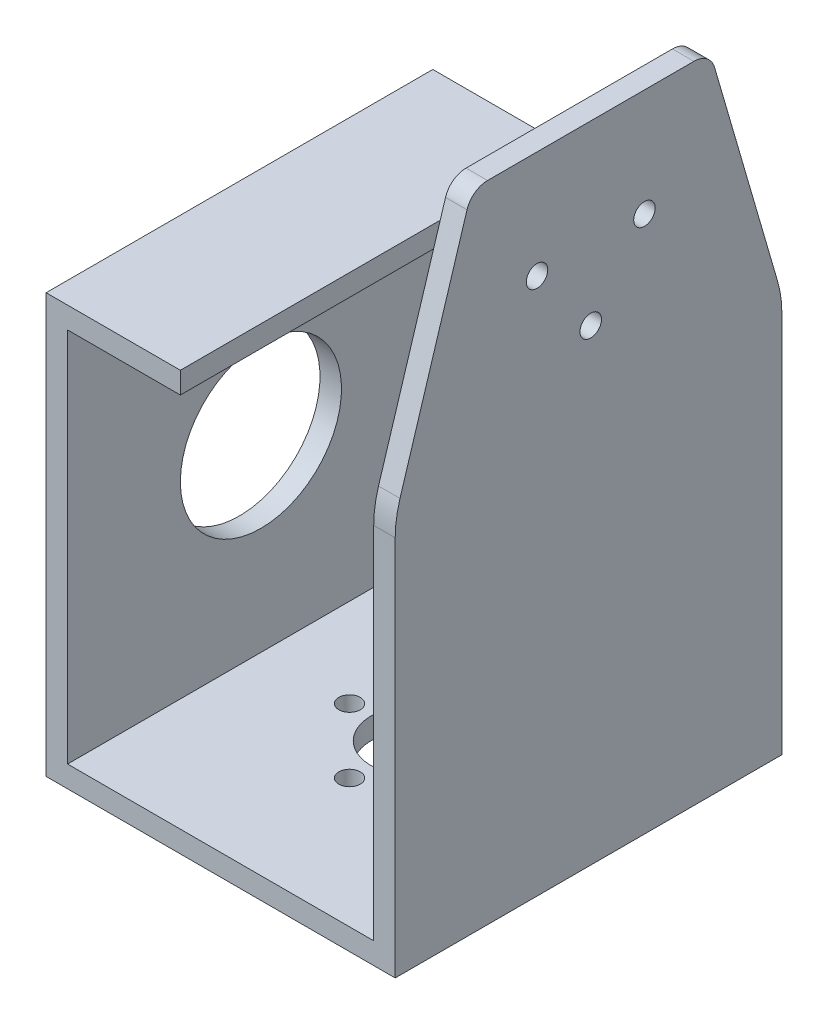
ISO-10303-21;
HEADER;
FILE_DESCRIPTION(('STEP AP214'),'2;1');
FILE_NAME('part.step','',(''),(''),'','','');
FILE_SCHEMA(('AUTOMOTIVE_DESIGN { 1 0 10303 214 1 1 1 1 }'));
ENDSEC;
DATA;
#1=APPLICATION_CONTEXT('core data for automotive mechanical design processes');
#2=APPLICATION_PROTOCOL_DEFINITION('international standard','automotive_design',2000,#1);
#3=PRODUCT_CONTEXT('',#1,'mechanical');
#4=PRODUCT('Part','Part','',(#3));
#5=PRODUCT_RELATED_PRODUCT_CATEGORY('part','',(#4));
#6=PRODUCT_DEFINITION_FORMATION('','',#4);
#7=PRODUCT_DEFINITION_CONTEXT('part definition',#1,'design');
#8=PRODUCT_DEFINITION('design','',#6,#7);
#9=PRODUCT_DEFINITION_SHAPE('','',#8);
#10=(LENGTH_UNIT() NAMED_UNIT(*) SI_UNIT(.MILLI.,.METRE.));
#11=(NAMED_UNIT(*) PLANE_ANGLE_UNIT() SI_UNIT($,.RADIAN.));
#12=(NAMED_UNIT(*) SI_UNIT($,.STERADIAN.) SOLID_ANGLE_UNIT());
#13=UNCERTAINTY_MEASURE_WITH_UNIT(LENGTH_MEASURE(1.E-05),#10,'distance_accuracy_value','');
#14=(GEOMETRIC_REPRESENTATION_CONTEXT(3) GLOBAL_UNCERTAINTY_ASSIGNED_CONTEXT((#13)) GLOBAL_UNIT_ASSIGNED_CONTEXT((#10,
#11,#12)) REPRESENTATION_CONTEXT('',''));
#15=CARTESIAN_POINT('',(0.,0.,0.));
#16=DIRECTION('',(0.,0.,1.));
#17=DIRECTION('',(1.,0.,0.));
#18=AXIS2_PLACEMENT_3D('',#15,#16,#17);
#19=CARTESIAN_POINT('',(20.,-37.,36.));
#20=DIRECTION('',(-1.,0.,0.));
#21=DIRECTION('',(0.,0.,1.));
#22=AXIS2_PLACEMENT_3D('',#19,#20,#21);
#23=PLANE('',#22);
#24=CARTESIAN_POINT('',(20.,13.,22.7976167047793));
#25=DIRECTION('',(1.,0.,0.));
#26=DIRECTION('',(0.,0.,-1.));
#27=AXIS2_PLACEMENT_3D('',#24,#25,#26);
#28=CIRCLE('',#27,1.);
#29=CARTESIAN_POINT('',(20.,13.,21.7976167047793));
#30=VERTEX_POINT('',#29);
#31=EDGE_CURVE('E194',#30,#30,#28,.T.);
#32=ORIENTED_EDGE('',*,*,#31,.F.);
#33=EDGE_LOOP('',(#32));
#34=FACE_BOUND('',#33,.T.);
#35=CARTESIAN_POINT('',(20.,13.,12.7976167047793));
#36=DIRECTION('',(1.,0.,0.));
#37=DIRECTION('',(0.,0.,-1.));
#38=AXIS2_PLACEMENT_3D('',#35,#36,#37);
#39=CIRCLE('',#38,1.);
#40=CARTESIAN_POINT('',(20.,13.,11.7976167047793));
#41=VERTEX_POINT('',#40);
#42=EDGE_CURVE('E186',#41,#41,#39,.T.);
#43=ORIENTED_EDGE('',*,*,#42,.F.);
#44=EDGE_LOOP('',(#43));
#45=FACE_BOUND('',#44,.T.);
#46=CARTESIAN_POINT('',(20.,6.5,17.7976167047793));
#47=DIRECTION('',(1.,0.,0.));
#48=DIRECTION('',(0.,0.,-1.));
#49=AXIS2_PLACEMENT_3D('',#46,#47,#48);
#50=CIRCLE('',#49,1.);
#51=CARTESIAN_POINT('',(20.,6.5,16.7976167047793));
#52=VERTEX_POINT('',#51);
#53=EDGE_CURVE('E197',#52,#52,#50,.T.);
#54=ORIENTED_EDGE('',*,*,#53,.F.);
#55=EDGE_LOOP('',(#54));
#56=FACE_BOUND('',#55,.T.);
#57=CARTESIAN_POINT('',(20.,-1.5128516171511,26.));
#58=DIRECTION('',(1.,0.,0.));
#59=DIRECTION('',(0.,0.,-1.));
#60=AXIS2_PLACEMENT_3D('',#57,#58,#59);
#61=CIRCLE('',#60,10.);
#62=CARTESIAN_POINT('',(20.,1.44515121428843,35.5524980632919));
#63=VERTEX_POINT('',#62);
#64=CARTESIAN_POINT('',(20.,-1.51285161715114,36.));
#65=VERTEX_POINT('',#64);
#66=EDGE_CURVE('E182',#63,#65,#61,.T.);
#67=ORIENTED_EDGE('',*,*,#66,.T.);
#68=DIRECTION('',(0.,1.,0.));
#69=VECTOR('',#68,1.);
#70=CARTESIAN_POINT('',(20.,-37.,36.));
#71=LINE('',#70,#69);
#72=CARTESIAN_POINT('',(20.,-37.,36.));
#73=VERTEX_POINT('',#72);
#74=EDGE_CURVE('E216',#73,#65,#71,.T.);
#75=ORIENTED_EDGE('',*,*,#74,.F.);
#76=DIRECTION('',(0.,0.,-1.));
#77=VECTOR('',#76,1.);
#78=CARTESIAN_POINT('',(20.,-37.,36.));
#79=LINE('',#78,#77);
#80=CARTESIAN_POINT('',(20.,-37.,0.));
#81=VERTEX_POINT('',#80);
#82=EDGE_CURVE('E263',#73,#81,#79,.T.);
#83=ORIENTED_EDGE('',*,*,#82,.T.);
#84=DIRECTION('',(0.,1.,0.));
#85=VECTOR('',#84,1.);
#86=CARTESIAN_POINT('',(20.,-37.,0.));
#87=LINE('',#86,#85);
#88=CARTESIAN_POINT('',(20.,-1.42495068080421,0.));
#89=VERTEX_POINT('',#88);
#90=EDGE_CURVE('E238',#81,#89,#87,.T.);
#91=ORIENTED_EDGE('',*,*,#90,.T.);
#92=CARTESIAN_POINT('',(20.,-1.42495068080419,10.));
#93=DIRECTION('',(1.,0.,0.));
#94=DIRECTION('',(0.,0.,-1.));
#95=AXIS2_PLACEMENT_3D('',#92,#93,#94);
#96=CIRCLE('',#95,10.);
#97=CARTESIAN_POINT('',(20.,1.36823547054476,0.398015250797762));
#98=VERTEX_POINT('',#97);
#99=EDGE_CURVE('E58',#89,#98,#96,.T.);
#100=ORIENTED_EDGE('',*,*,#99,.T.);
#101=DIRECTION('',(0.,0.960198474920225,0.279318615134893));
#102=VECTOR('',#101,1.);
#103=CARTESIAN_POINT('',(20.,1.36823547054476,0.398015250797761));
#104=LINE('',#103,#102);
#105=CARTESIAN_POINT('',(20.,21.5586372302698,6.27133749181885));
#106=VERTEX_POINT('',#105);
#107=EDGE_CURVE('E153',#98,#106,#104,.T.);
#108=ORIENTED_EDGE('',*,*,#107,.T.);
#109=CARTESIAN_POINT('',(20.,21.,8.1917344416593));
#110=DIRECTION('',(1.,0.,0.));
#111=DIRECTION('',(0.,0.,-1.));
#112=AXIS2_PLACEMENT_3D('',#109,#110,#111);
#113=CIRCLE('',#112,2.);
#114=CARTESIAN_POINT('',(20.,23.,8.19173444165931));
#115=VERTEX_POINT('',#114);
#116=EDGE_CURVE('E162',#106,#115,#113,.T.);
#117=ORIENTED_EDGE('',*,*,#116,.T.);
#118=DIRECTION('',(0.,0.,-1.));
#119=VECTOR('',#118,1.);
#120=CARTESIAN_POINT('',(20.,23.,36.));
#121=LINE('',#120,#119);
#122=CARTESIAN_POINT('',(20.,23.,27.4034989678992));
#123=VERTEX_POINT('',#122);
#124=EDGE_CURVE('E261',#123,#115,#121,.T.);
#125=ORIENTED_EDGE('',*,*,#124,.F.);
#126=CARTESIAN_POINT('',(20.,21.,27.4034989678992));
#127=DIRECTION('',(1.,0.,0.));
#128=DIRECTION('',(0.,0.,1.));
#129=AXIS2_PLACEMENT_3D('',#126,#127,#128);
#130=CIRCLE('',#129,2.);
#131=CARTESIAN_POINT('',(20.,21.5916005662879,29.3139985805576));
#132=VERTEX_POINT('',#131);
#133=EDGE_CURVE('E168',#123,#132,#130,.T.);
#134=ORIENTED_EDGE('',*,*,#133,.T.);
#135=DIRECTION('',(0.,-0.955249806329192,0.295800283143951));
#136=VECTOR('',#135,1.);
#137=CARTESIAN_POINT('',(20.,1.44515121428843,35.5524980632919));
#138=LINE('',#137,#136);
#139=EDGE_CURVE('E179',#132,#63,#138,.T.);
#140=ORIENTED_EDGE('',*,*,#139,.T.);
#141=EDGE_LOOP('',(#67,#75,#83,#91,#100,#108,#117,#125,#134,#140));
#142=FACE_BOUND('',#141,.T.);
#143=ADVANCED_FACE('F33',(#34,#45,#56,#142),#23,.F.);
#144=CARTESIAN_POINT('',(18.,23.,36.));
#145=DIRECTION('',(0.,-1.,0.));
#146=DIRECTION('',(0.,0.,-1.));
#147=AXIS2_PLACEMENT_3D('',#144,#145,#146);
#148=PLANE('',#147);
#149=DIRECTION('',(0.,0.,-1.));
#150=VECTOR('',#149,1.);
#151=CARTESIAN_POINT('',(18.,23.,36.));
#152=LINE('',#151,#150);
#153=CARTESIAN_POINT('',(18.,23.,27.4034989678992));
#154=VERTEX_POINT('',#153);
#155=CARTESIAN_POINT('',(18.,23.,8.19173444165931));
#156=VERTEX_POINT('',#155);
#157=EDGE_CURVE('E258',#154,#156,#152,.T.);
#158=ORIENTED_EDGE('',*,*,#157,.F.);
#159=DIRECTION('',(1.,0.,0.));
#160=VECTOR('',#159,1.);
#161=CARTESIAN_POINT('',(15.,23.,27.4034989678992));
#162=LINE('',#161,#160);
#163=EDGE_CURVE('E189',#154,#123,#162,.T.);
#164=ORIENTED_EDGE('',*,*,#163,.T.);
#165=ORIENTED_EDGE('',*,*,#124,.T.);
#166=DIRECTION('',(1.,0.,0.));
#167=VECTOR('',#166,1.);
#168=CARTESIAN_POINT('',(15.,23.,8.19173444165931));
#169=LINE('',#168,#167);
#170=EDGE_CURVE('E158',#156,#115,#169,.T.);
#171=ORIENTED_EDGE('',*,*,#170,.F.);
#172=EDGE_LOOP('',(#158,#164,#165,#171));
#173=FACE_BOUND('',#172,.T.);
#174=ADVANCED_FACE('F368',(#173),#148,.F.);
#175=CARTESIAN_POINT('',(18.,-35.,36.));
#176=DIRECTION('',(1.,0.,0.));
#177=DIRECTION('',(0.,0.,-1.));
#178=AXIS2_PLACEMENT_3D('',#175,#176,#177);
#179=PLANE('',#178);
#180=CARTESIAN_POINT('',(18.,13.,22.7976167047793));
#181=DIRECTION('',(1.,0.,0.));
#182=DIRECTION('',(0.,0.,-1.));
#183=AXIS2_PLACEMENT_3D('',#180,#181,#182);
#184=CIRCLE('',#183,1.);
#185=CARTESIAN_POINT('',(18.,13.,21.7976167047793));
#186=VERTEX_POINT('',#185);
#187=EDGE_CURVE('E232',#186,#186,#184,.T.);
#188=ORIENTED_EDGE('',*,*,#187,.T.);
#189=EDGE_LOOP('',(#188));
#190=FACE_BOUND('',#189,.T.);
#191=CARTESIAN_POINT('',(18.,13.,12.7976167047793));
#192=DIRECTION('',(1.,0.,0.));
#193=DIRECTION('',(0.,0.,-1.));
#194=AXIS2_PLACEMENT_3D('',#191,#192,#193);
#195=CIRCLE('',#194,1.);
#196=CARTESIAN_POINT('',(18.,13.,11.7976167047793));
#197=VERTEX_POINT('',#196);
#198=EDGE_CURVE('E281',#197,#197,#195,.T.);
#199=ORIENTED_EDGE('',*,*,#198,.T.);
#200=EDGE_LOOP('',(#199));
#201=FACE_BOUND('',#200,.T.);
#202=CARTESIAN_POINT('',(18.,6.5,17.7976167047793));
#203=DIRECTION('',(1.,0.,0.));
#204=DIRECTION('',(0.,0.,-1.));
#205=AXIS2_PLACEMENT_3D('',#202,#203,#204);
#206=CIRCLE('',#205,1.);
#207=CARTESIAN_POINT('',(18.,6.5,16.7976167047793));
#208=VERTEX_POINT('',#207);
#209=EDGE_CURVE('E205',#208,#208,#206,.T.);
#210=ORIENTED_EDGE('',*,*,#209,.T.);
#211=EDGE_LOOP('',(#210));
#212=FACE_BOUND('',#211,.T.);
#213=CARTESIAN_POINT('',(18.,-1.5128516171511,26.));
#214=DIRECTION('',(1.,0.,0.));
#215=DIRECTION('',(0.,0.,-1.));
#216=AXIS2_PLACEMENT_3D('',#213,#214,#215);
#217=CIRCLE('',#216,10.);
#218=CARTESIAN_POINT('',(18.,1.44515121428843,35.5524980632919));
#219=VERTEX_POINT('',#218);
#220=CARTESIAN_POINT('',(18.,-1.51285161715112,36.));
#221=VERTEX_POINT('',#220);
#222=EDGE_CURVE('E50',#219,#221,#217,.T.);
#223=ORIENTED_EDGE('',*,*,#222,.F.);
#224=DIRECTION('',(0.,-0.955249806329192,0.295800283143951));
#225=VECTOR('',#224,1.);
#226=CARTESIAN_POINT('',(18.,-31.9375767372186,45.8897107114883));
#227=LINE('',#226,#225);
#228=CARTESIAN_POINT('',(18.,21.5916005662879,29.3139985805576));
#229=VERTEX_POINT('',#228);
#230=EDGE_CURVE('E12',#229,#219,#227,.T.);
#231=ORIENTED_EDGE('',*,*,#230,.F.);
#232=CARTESIAN_POINT('',(18.,21.,27.4034989678992));
#233=DIRECTION('',(1.,0.,0.));
#234=DIRECTION('',(0.,0.,-1.));
#235=AXIS2_PLACEMENT_3D('',#232,#233,#234);
#236=CIRCLE('',#235,2.);
#237=EDGE_CURVE('E42',#154,#229,#236,.T.);
#238=ORIENTED_EDGE('',*,*,#237,.F.);
#239=ORIENTED_EDGE('',*,*,#157,.T.);
#240=CARTESIAN_POINT('',(18.,21.,8.1917344416593));
#241=DIRECTION('',(1.,0.,0.));
#242=DIRECTION('',(0.,0.,-1.));
#243=AXIS2_PLACEMENT_3D('',#240,#241,#242);
#244=CIRCLE('',#243,2.);
#245=CARTESIAN_POINT('',(18.,21.5586372302698,6.27133749181885));
#246=VERTEX_POINT('',#245);
#247=EDGE_CURVE('E283',#246,#156,#244,.T.);
#248=ORIENTED_EDGE('',*,*,#247,.F.);
#249=DIRECTION('',(0.,0.960198474920225,0.279318615134893));
#250=VECTOR('',#249,1.);
#251=CARTESIAN_POINT('',(18.,-22.6140917956727,-6.5783657940359));
#252=LINE('',#251,#250);
#253=CARTESIAN_POINT('',(18.,1.36823547054476,0.398015250797761));
#254=VERTEX_POINT('',#253);
#255=EDGE_CURVE('E155',#254,#246,#252,.T.);
#256=ORIENTED_EDGE('',*,*,#255,.F.);
#257=CARTESIAN_POINT('',(18.,-1.42495068080419,10.));
#258=DIRECTION('',(1.,0.,0.));
#259=DIRECTION('',(0.,0.,-1.));
#260=AXIS2_PLACEMENT_3D('',#257,#258,#259);
#261=CIRCLE('',#260,10.);
#262=CARTESIAN_POINT('',(18.,-1.42495068080423,0.));
#263=VERTEX_POINT('',#262);
#264=EDGE_CURVE('E202',#263,#254,#261,.T.);
#265=ORIENTED_EDGE('',*,*,#264,.F.);
#266=DIRECTION('',(0.,-1.,0.));
#267=VECTOR('',#266,1.);
#268=CARTESIAN_POINT('',(18.,-35.,0.));
#269=LINE('',#268,#267);
#270=CARTESIAN_POINT('',(18.,-35.,0.));
#271=VERTEX_POINT('',#270);
#272=EDGE_CURVE('E240',#263,#271,#269,.T.);
#273=ORIENTED_EDGE('',*,*,#272,.T.);
#274=DIRECTION('',(0.,0.,-1.));
#275=VECTOR('',#274,1.);
#276=CARTESIAN_POINT('',(18.,-35.,36.));
#277=LINE('',#276,#275);
#278=CARTESIAN_POINT('',(18.,-35.,36.));
#279=VERTEX_POINT('',#278);
#280=EDGE_CURVE('E255',#279,#271,#277,.T.);
#281=ORIENTED_EDGE('',*,*,#280,.F.);
#282=DIRECTION('',(0.,-1.,0.));
#283=VECTOR('',#282,1.);
#284=CARTESIAN_POINT('',(18.,-35.,36.));
#285=LINE('',#284,#283);
#286=EDGE_CURVE('E219',#221,#279,#285,.T.);
#287=ORIENTED_EDGE('',*,*,#286,.F.);
#288=EDGE_LOOP('',(#223,#231,#238,#239,#248,#256,#265,#273,#281,#287));
#289=FACE_BOUND('',#288,.T.);
#290=ADVANCED_FACE('F363',(#190,#201,#212,#289),#179,.F.);
#291=CARTESIAN_POINT('',(0.,0.,36.));
#292=DIRECTION('',(0.,0.,-1.));
#293=DIRECTION('',(-1.,0.,0.));
#294=AXIS2_PLACEMENT_3D('',#291,#292,#293);
#295=PLANE('',#294);
#296=DIRECTION('',(-1.,0.,0.));
#297=VECTOR('',#296,1.);
#298=CARTESIAN_POINT('',(-10.5,-35.,36.));
#299=LINE('',#298,#297);
#300=CARTESIAN_POINT('',(-10.5,-35.,36.));
#301=VERTEX_POINT('',#300);
#302=EDGE_CURVE('E221',#279,#301,#299,.T.);
#303=ORIENTED_EDGE('',*,*,#302,.T.);
#304=DIRECTION('',(0.,1.,0.));
#305=VECTOR('',#304,1.);
#306=CARTESIAN_POINT('',(-10.5,0.,36.));
#307=LINE('',#306,#305);
#308=CARTESIAN_POINT('',(-10.5,0.,36.));
#309=VERTEX_POINT('',#308);
#310=EDGE_CURVE('E223',#301,#309,#307,.T.);
#311=ORIENTED_EDGE('',*,*,#310,.T.);
#312=DIRECTION('',(1.,0.,0.));
#313=VECTOR('',#312,1.);
#314=CARTESIAN_POINT('',(0.,0.,36.));
#315=LINE('',#314,#313);
#316=CARTESIAN_POINT('',(0.,0.,36.));
#317=VERTEX_POINT('',#316);
#318=EDGE_CURVE('E225',#309,#317,#315,.T.);
#319=ORIENTED_EDGE('',*,*,#318,.T.);
#320=DIRECTION('',(0.,1.,0.));
#321=VECTOR('',#320,1.);
#322=CARTESIAN_POINT('',(0.,2.,36.));
#323=LINE('',#322,#321);
#324=CARTESIAN_POINT('',(0.,2.,36.));
#325=VERTEX_POINT('',#324);
#326=EDGE_CURVE('E206',#317,#325,#323,.T.);
#327=ORIENTED_EDGE('',*,*,#326,.T.);
#328=DIRECTION('',(-1.,0.,0.));
#329=VECTOR('',#328,1.);
#330=CARTESIAN_POINT('',(0.,2.,36.));
#331=LINE('',#330,#329);
#332=CARTESIAN_POINT('',(-12.5,2.,36.));
#333=VERTEX_POINT('',#332);
#334=EDGE_CURVE('E209',#325,#333,#331,.T.);
#335=ORIENTED_EDGE('',*,*,#334,.T.);
#336=DIRECTION('',(0.,-1.,0.));
#337=VECTOR('',#336,1.);
#338=CARTESIAN_POINT('',(-12.5,2.,36.));
#339=LINE('',#338,#337);
#340=CARTESIAN_POINT('',(-12.5,-37.,36.));
#341=VERTEX_POINT('',#340);
#342=EDGE_CURVE('E212',#333,#341,#339,.T.);
#343=ORIENTED_EDGE('',*,*,#342,.T.);
#344=DIRECTION('',(1.,0.,0.));
#345=VECTOR('',#344,1.);
#346=CARTESIAN_POINT('',(-12.5,-37.,36.));
#347=LINE('',#346,#345);
#348=EDGE_CURVE('E214',#341,#73,#347,.T.);
#349=ORIENTED_EDGE('',*,*,#348,.T.);
#350=ORIENTED_EDGE('',*,*,#74,.T.);
#351=DIRECTION('',(1.,0.,0.));
#352=VECTOR('',#351,1.);
#353=CARTESIAN_POINT('',(15.,-1.5128516171511,36.));
#354=LINE('',#353,#352);
#355=EDGE_CURVE('E277',#221,#65,#354,.T.);
#356=ORIENTED_EDGE('',*,*,#355,.F.);
#357=ORIENTED_EDGE('',*,*,#286,.T.);
#358=EDGE_LOOP('',(#303,#311,#319,#327,#335,#343,#349,#350,#356,#357));
#359=FACE_BOUND('',#358,.T.);
#360=ADVANCED_FACE('F349',(#359),#295,.F.);
#361=CARTESIAN_POINT('',(0.,0.,0.));
#362=DIRECTION('',(0.,0.,-1.));
#363=DIRECTION('',(-1.,0.,0.));
#364=AXIS2_PLACEMENT_3D('',#361,#362,#363);
#365=PLANE('',#364);
#366=ORIENTED_EDGE('',*,*,#90,.F.);
#367=DIRECTION('',(1.,0.,0.));
#368=VECTOR('',#367,1.);
#369=CARTESIAN_POINT('',(-12.5,-37.,0.));
#370=LINE('',#369,#368);
#371=CARTESIAN_POINT('',(-12.5,-37.,0.));
#372=VERTEX_POINT('',#371);
#373=EDGE_CURVE('E236',#372,#81,#370,.T.);
#374=ORIENTED_EDGE('',*,*,#373,.F.);
#375=DIRECTION('',(0.,-1.,0.));
#376=VECTOR('',#375,1.);
#377=CARTESIAN_POINT('',(-12.5,2.,0.));
#378=LINE('',#377,#376);
#379=CARTESIAN_POINT('',(-12.5,2.,0.));
#380=VERTEX_POINT('',#379);
#381=EDGE_CURVE('E234',#380,#372,#378,.T.);
#382=ORIENTED_EDGE('',*,*,#381,.F.);
#383=DIRECTION('',(-1.,0.,0.));
#384=VECTOR('',#383,1.);
#385=CARTESIAN_POINT('',(0.,2.,0.));
#386=LINE('',#385,#384);
#387=CARTESIAN_POINT('',(0.,2.,0.));
#388=VERTEX_POINT('',#387);
#389=EDGE_CURVE('E231',#388,#380,#386,.T.);
#390=ORIENTED_EDGE('',*,*,#389,.F.);
#391=DIRECTION('',(0.,1.,0.));
#392=VECTOR('',#391,1.);
#393=CARTESIAN_POINT('',(0.,2.,0.));
#394=LINE('',#393,#392);
#395=CARTESIAN_POINT('',(0.,0.,0.));
#396=VERTEX_POINT('',#395);
#397=EDGE_CURVE('E228',#396,#388,#394,.T.);
#398=ORIENTED_EDGE('',*,*,#397,.F.);
#399=DIRECTION('',(1.,0.,0.));
#400=VECTOR('',#399,1.);
#401=CARTESIAN_POINT('',(0.,0.,0.));
#402=LINE('',#401,#400);
#403=CARTESIAN_POINT('',(-10.5,0.,0.));
#404=VERTEX_POINT('',#403);
#405=EDGE_CURVE('E210',#404,#396,#402,.T.);
#406=ORIENTED_EDGE('',*,*,#405,.F.);
#407=DIRECTION('',(0.,1.,0.));
#408=VECTOR('',#407,1.);
#409=CARTESIAN_POINT('',(-10.5,0.,0.));
#410=LINE('',#409,#408);
#411=CARTESIAN_POINT('',(-10.5,-35.,0.));
#412=VERTEX_POINT('',#411);
#413=EDGE_CURVE('E244',#412,#404,#410,.T.);
#414=ORIENTED_EDGE('',*,*,#413,.F.);
#415=DIRECTION('',(-1.,0.,0.));
#416=VECTOR('',#415,1.);
#417=CARTESIAN_POINT('',(-10.5,-35.,0.));
#418=LINE('',#417,#416);
#419=EDGE_CURVE('E242',#271,#412,#418,.T.);
#420=ORIENTED_EDGE('',*,*,#419,.F.);
#421=ORIENTED_EDGE('',*,*,#272,.F.);
#422=DIRECTION('',(1.,0.,0.));
#423=VECTOR('',#422,1.);
#424=CARTESIAN_POINT('',(15.,-1.42495068080419,0.));
#425=LINE('',#424,#423);
#426=EDGE_CURVE('E275',#263,#89,#425,.T.);
#427=ORIENTED_EDGE('',*,*,#426,.T.);
#428=EDGE_LOOP('',(#366,#374,#382,#390,#398,#406,#414,#420,#421,#427));
#429=FACE_BOUND('',#428,.T.);
#430=ADVANCED_FACE('F357',(#429),#365,.T.);
#431=CARTESIAN_POINT('',(0.,2.,36.));
#432=DIRECTION('',(-1.,0.,0.));
#433=DIRECTION('',(0.,0.,1.));
#434=AXIS2_PLACEMENT_3D('',#431,#432,#433);
#435=PLANE('',#434);
#436=ORIENTED_EDGE('',*,*,#397,.T.);
#437=DIRECTION('',(0.,0.,-1.));
#438=VECTOR('',#437,1.);
#439=CARTESIAN_POINT('',(0.,2.,36.));
#440=LINE('',#439,#438);
#441=EDGE_CURVE('E272',#325,#388,#440,.T.);
#442=ORIENTED_EDGE('',*,*,#441,.F.);
#443=ORIENTED_EDGE('',*,*,#326,.F.);
#444=DIRECTION('',(0.,0.,-1.));
#445=VECTOR('',#444,1.);
#446=CARTESIAN_POINT('',(0.,0.,36.));
#447=LINE('',#446,#445);
#448=EDGE_CURVE('E227',#317,#396,#447,.T.);
#449=ORIENTED_EDGE('',*,*,#448,.T.);
#450=EDGE_LOOP('',(#436,#442,#443,#449));
#451=FACE_BOUND('',#450,.T.);
#452=ADVANCED_FACE('F35',(#451),#435,.F.);
#453=CARTESIAN_POINT('',(0.,2.,36.));
#454=DIRECTION('',(0.,-1.,0.));
#455=DIRECTION('',(0.,0.,-1.));
#456=AXIS2_PLACEMENT_3D('',#453,#454,#455);
#457=PLANE('',#456);
#458=ORIENTED_EDGE('',*,*,#389,.T.);
#459=DIRECTION('',(0.,0.,-1.));
#460=VECTOR('',#459,1.);
#461=CARTESIAN_POINT('',(-12.5,2.,36.));
#462=LINE('',#461,#460);
#463=EDGE_CURVE('E269',#333,#380,#462,.T.);
#464=ORIENTED_EDGE('',*,*,#463,.F.);
#465=ORIENTED_EDGE('',*,*,#334,.F.);
#466=ORIENTED_EDGE('',*,*,#441,.T.);
#467=EDGE_LOOP('',(#458,#464,#465,#466));
#468=FACE_BOUND('',#467,.T.);
#469=ADVANCED_FACE('F402',(#468),#457,.F.);
#470=CARTESIAN_POINT('',(-12.5,2.,36.));
#471=DIRECTION('',(1.,0.,0.));
#472=DIRECTION('',(0.,0.,-1.));
#473=AXIS2_PLACEMENT_3D('',#470,#471,#472);
#474=PLANE('',#473);
#475=CARTESIAN_POINT('',(-12.5,-17.5,18.));
#476=DIRECTION('',(-1.,0.,0.));
#477=DIRECTION('',(0.,0.,1.));
#478=AXIS2_PLACEMENT_3D('',#475,#476,#477);
#479=CIRCLE('',#478,7.5);
#480=CARTESIAN_POINT('',(-12.5,-17.5,25.5));
#481=VERTEX_POINT('',#480);
#482=EDGE_CURVE('E292',#481,#481,#479,.T.);
#483=ORIENTED_EDGE('',*,*,#482,.F.);
#484=EDGE_LOOP('',(#483));
#485=FACE_BOUND('',#484,.T.);
#486=ORIENTED_EDGE('',*,*,#381,.T.);
#487=DIRECTION('',(0.,0.,-1.));
#488=VECTOR('',#487,1.);
#489=CARTESIAN_POINT('',(-12.5,-37.,36.));
#490=LINE('',#489,#488);
#491=EDGE_CURVE('E266',#341,#372,#490,.T.);
#492=ORIENTED_EDGE('',*,*,#491,.F.);
#493=ORIENTED_EDGE('',*,*,#342,.F.);
#494=ORIENTED_EDGE('',*,*,#463,.T.);
#495=EDGE_LOOP('',(#486,#492,#493,#494));
#496=FACE_BOUND('',#495,.T.);
#497=ADVANCED_FACE('F335',(#485,#496),#474,.F.);
#498=CARTESIAN_POINT('',(-12.5,-37.,36.));
#499=DIRECTION('',(0.,1.,0.));
#500=DIRECTION('',(0.,0.,1.));
#501=AXIS2_PLACEMENT_3D('',#498,#499,#500);
#502=PLANE('',#501);
#503=CARTESIAN_POINT('',(3.75,-37.,12.));
#504=DIRECTION('',(0.,-1.,0.));
#505=DIRECTION('',(0.,0.,-1.));
#506=AXIS2_PLACEMENT_3D('',#503,#504,#505);
#507=CIRCLE('',#506,1.);
#508=CARTESIAN_POINT('',(3.75,-37.,11.));
#509=VERTEX_POINT('',#508);
#510=EDGE_CURVE('E315',#509,#509,#507,.T.);
#511=ORIENTED_EDGE('',*,*,#510,.F.);
#512=EDGE_LOOP('',(#511));
#513=FACE_BOUND('',#512,.T.);
#514=CARTESIAN_POINT('',(3.75,-37.,24.));
#515=DIRECTION('',(0.,-1.,0.));
#516=DIRECTION('',(0.,0.,-1.));
#517=AXIS2_PLACEMENT_3D('',#514,#515,#516);
#518=CIRCLE('',#517,0.999999999999999);
#519=CARTESIAN_POINT('',(3.75,-37.,23.));
#520=VERTEX_POINT('',#519);
#521=EDGE_CURVE('E316',#520,#520,#518,.T.);
#522=ORIENTED_EDGE('',*,*,#521,.F.);
#523=EDGE_LOOP('',(#522));
#524=FACE_BOUND('',#523,.T.);
#525=CARTESIAN_POINT('',(9.75,-37.,18.));
#526=DIRECTION('',(0.,-1.,0.));
#527=DIRECTION('',(0.,0.,-1.));
#528=AXIS2_PLACEMENT_3D('',#525,#526,#527);
#529=CIRCLE('',#528,1.);
#530=CARTESIAN_POINT('',(9.75,-37.,17.));
#531=VERTEX_POINT('',#530);
#532=EDGE_CURVE('E319',#531,#531,#529,.T.);
#533=ORIENTED_EDGE('',*,*,#532,.F.);
#534=EDGE_LOOP('',(#533));
#535=FACE_BOUND('',#534,.T.);
#536=CARTESIAN_POINT('',(-2.25,-37.,18.));
#537=DIRECTION('',(0.,-1.,0.));
#538=DIRECTION('',(0.,0.,-1.));
#539=AXIS2_PLACEMENT_3D('',#536,#537,#538);
#540=CIRCLE('',#539,1.);
#541=CARTESIAN_POINT('',(-2.25,-37.,17.));
#542=VERTEX_POINT('',#541);
#543=EDGE_CURVE('E322',#542,#542,#540,.T.);
#544=ORIENTED_EDGE('',*,*,#543,.F.);
#545=EDGE_LOOP('',(#544));
#546=FACE_BOUND('',#545,.T.);
#547=CARTESIAN_POINT('',(3.75,-37.,18.));
#548=DIRECTION('',(0.,-1.,0.));
#549=DIRECTION('',(0.,0.,-1.));
#550=AXIS2_PLACEMENT_3D('',#547,#548,#549);
#551=CIRCLE('',#550,4.);
#552=CARTESIAN_POINT('',(3.75,-37.,14.));
#553=VERTEX_POINT('',#552);
#554=EDGE_CURVE('E297',#553,#553,#551,.T.);
#555=ORIENTED_EDGE('',*,*,#554,.F.);
#556=EDGE_LOOP('',(#555));
#557=FACE_BOUND('',#556,.T.);
#558=ORIENTED_EDGE('',*,*,#82,.F.);
#559=ORIENTED_EDGE('',*,*,#348,.F.);
#560=ORIENTED_EDGE('',*,*,#491,.T.);
#561=ORIENTED_EDGE('',*,*,#373,.T.);
#562=EDGE_LOOP('',(#558,#559,#560,#561));
#563=FACE_BOUND('',#562,.T.);
#564=ADVANCED_FACE('F331',(#513,#524,#535,#546,#557,#563),#502,.F.);
#565=CARTESIAN_POINT('',(-10.5,-35.,36.));
#566=DIRECTION('',(0.,-1.,0.));
#567=DIRECTION('',(0.,0.,-1.));
#568=AXIS2_PLACEMENT_3D('',#565,#566,#567);
#569=PLANE('',#568);
#570=CARTESIAN_POINT('',(3.75,-35.,12.));
#571=DIRECTION('',(0.,-1.,0.));
#572=DIRECTION('',(0.,0.,-1.));
#573=AXIS2_PLACEMENT_3D('',#570,#571,#572);
#574=CIRCLE('',#573,1.);
#575=CARTESIAN_POINT('',(3.75,-35.,11.));
#576=VERTEX_POINT('',#575);
#577=EDGE_CURVE('E37',#576,#576,#574,.T.);
#578=ORIENTED_EDGE('',*,*,#577,.T.);
#579=EDGE_LOOP('',(#578));
#580=FACE_BOUND('',#579,.T.);
#581=CARTESIAN_POINT('',(3.75,-35.,24.));
#582=DIRECTION('',(0.,-1.,0.));
#583=DIRECTION('',(0.,0.,-1.));
#584=AXIS2_PLACEMENT_3D('',#581,#582,#583);
#585=CIRCLE('',#584,0.999999999999999);
#586=CARTESIAN_POINT('',(3.75,-35.,23.));
#587=VERTEX_POINT('',#586);
#588=EDGE_CURVE('E302',#587,#587,#585,.T.);
#589=ORIENTED_EDGE('',*,*,#588,.T.);
#590=EDGE_LOOP('',(#589));
#591=FACE_BOUND('',#590,.T.);
#592=CARTESIAN_POINT('',(9.75,-35.,18.));
#593=DIRECTION('',(0.,-1.,0.));
#594=DIRECTION('',(0.,0.,-1.));
#595=AXIS2_PLACEMENT_3D('',#592,#593,#594);
#596=CIRCLE('',#595,1.);
#597=CARTESIAN_POINT('',(9.75,-35.,17.));
#598=VERTEX_POINT('',#597);
#599=EDGE_CURVE('E300',#598,#598,#596,.T.);
#600=ORIENTED_EDGE('',*,*,#599,.T.);
#601=EDGE_LOOP('',(#600));
#602=FACE_BOUND('',#601,.T.);
#603=CARTESIAN_POINT('',(-2.25,-35.,18.));
#604=DIRECTION('',(0.,-1.,0.));
#605=DIRECTION('',(0.,0.,-1.));
#606=AXIS2_PLACEMENT_3D('',#603,#604,#605);
#607=CIRCLE('',#606,1.);
#608=CARTESIAN_POINT('',(-2.25,-35.,17.));
#609=VERTEX_POINT('',#608);
#610=EDGE_CURVE('E296',#609,#609,#607,.T.);
#611=ORIENTED_EDGE('',*,*,#610,.T.);
#612=EDGE_LOOP('',(#611));
#613=FACE_BOUND('',#612,.T.);
#614=CARTESIAN_POINT('',(3.75,-35.,18.));
#615=DIRECTION('',(0.,-1.,0.));
#616=DIRECTION('',(0.,0.,-1.));
#617=AXIS2_PLACEMENT_3D('',#614,#615,#616);
#618=CIRCLE('',#617,4.);
#619=CARTESIAN_POINT('',(3.75,-35.,14.));
#620=VERTEX_POINT('',#619);
#621=EDGE_CURVE('E293',#620,#620,#618,.T.);
#622=ORIENTED_EDGE('',*,*,#621,.T.);
#623=EDGE_LOOP('',(#622));
#624=FACE_BOUND('',#623,.T.);
#625=ORIENTED_EDGE('',*,*,#419,.T.);
#626=DIRECTION('',(0.,0.,-1.));
#627=VECTOR('',#626,1.);
#628=CARTESIAN_POINT('',(-10.5,-35.,36.));
#629=LINE('',#628,#627);
#630=EDGE_CURVE('E252',#301,#412,#629,.T.);
#631=ORIENTED_EDGE('',*,*,#630,.F.);
#632=ORIENTED_EDGE('',*,*,#302,.F.);
#633=ORIENTED_EDGE('',*,*,#280,.T.);
#634=EDGE_LOOP('',(#625,#631,#632,#633));
#635=FACE_BOUND('',#634,.T.);
#636=ADVANCED_FACE('F334',(#580,#591,#602,#613,#624,#635),#569,.F.);
#637=CARTESIAN_POINT('',(-10.5,0.,36.));
#638=DIRECTION('',(-1.,0.,0.));
#639=DIRECTION('',(0.,-1.,0.));
#640=AXIS2_PLACEMENT_3D('',#637,#638,#639);
#641=PLANE('',#640);
#642=CARTESIAN_POINT('',(-10.5,-17.5,18.));
#643=DIRECTION('',(-1.,0.,0.));
#644=DIRECTION('',(0.,-1.,0.));
#645=AXIS2_PLACEMENT_3D('',#642,#643,#644);
#646=CIRCLE('',#645,7.5);
#647=CARTESIAN_POINT('',(-10.5,-25.,18.));
#648=VERTEX_POINT('',#647);
#649=EDGE_CURVE('E173',#648,#648,#646,.T.);
#650=ORIENTED_EDGE('',*,*,#649,.T.);
#651=EDGE_LOOP('',(#650));
#652=FACE_BOUND('',#651,.T.);
#653=ORIENTED_EDGE('',*,*,#413,.T.);
#654=DIRECTION('',(0.,0.,-1.));
#655=VECTOR('',#654,1.);
#656=CARTESIAN_POINT('',(-10.5,0.,36.));
#657=LINE('',#656,#655);
#658=EDGE_CURVE('E249',#309,#404,#657,.T.);
#659=ORIENTED_EDGE('',*,*,#658,.F.);
#660=ORIENTED_EDGE('',*,*,#310,.F.);
#661=ORIENTED_EDGE('',*,*,#630,.T.);
#662=EDGE_LOOP('',(#653,#659,#660,#661));
#663=FACE_BOUND('',#662,.T.);
#664=ADVANCED_FACE('F422',(#652,#663),#641,.F.);
#665=CARTESIAN_POINT('',(0.,0.,36.));
#666=DIRECTION('',(0.,1.,0.));
#667=DIRECTION('',(0.,0.,1.));
#668=AXIS2_PLACEMENT_3D('',#665,#666,#667);
#669=PLANE('',#668);
#670=ORIENTED_EDGE('',*,*,#405,.T.);
#671=ORIENTED_EDGE('',*,*,#448,.F.);
#672=ORIENTED_EDGE('',*,*,#318,.F.);
#673=ORIENTED_EDGE('',*,*,#658,.T.);
#674=EDGE_LOOP('',(#670,#671,#672,#673));
#675=FACE_BOUND('',#674,.T.);
#676=ADVANCED_FACE('F418',(#675),#669,.F.);
#677=CARTESIAN_POINT('',(15.,-1.42495068080419,10.));
#678=DIRECTION('',(1.,0.,0.));
#679=DIRECTION('',(0.,0.,-1.));
#680=AXIS2_PLACEMENT_3D('',#677,#678,#679);
#681=CYLINDRICAL_SURFACE('',#680,10.);
#682=ORIENTED_EDGE('',*,*,#264,.T.);
#683=DIRECTION('',(1.,0.,0.));
#684=VECTOR('',#683,1.);
#685=CARTESIAN_POINT('',(15.,1.36823547054476,0.398015250797761));
#686=LINE('',#685,#684);
#687=EDGE_CURVE('E159',#254,#98,#686,.T.);
#688=ORIENTED_EDGE('',*,*,#687,.T.);
#689=ORIENTED_EDGE('',*,*,#99,.F.);
#690=ORIENTED_EDGE('',*,*,#426,.F.);
#691=EDGE_LOOP('',(#682,#688,#689,#690));
#692=FACE_BOUND('',#691,.T.);
#693=ADVANCED_FACE('F361',(#692),#681,.T.);
#694=CARTESIAN_POINT('',(15.,1.36823547054476,0.398015250797761));
#695=DIRECTION('',(0.,0.279318615134893,-0.960198474920225));
#696=DIRECTION('',(0.,0.960198474920225,0.279318615134893));
#697=AXIS2_PLACEMENT_3D('',#694,#695,#696);
#698=PLANE('',#697);
#699=ORIENTED_EDGE('',*,*,#255,.T.);
#700=DIRECTION('',(1.,0.,0.));
#701=VECTOR('',#700,1.);
#702=CARTESIAN_POINT('',(15.,21.5586372302698,6.27133749181885));
#703=LINE('',#702,#701);
#704=EDGE_CURVE('E148',#246,#106,#703,.T.);
#705=ORIENTED_EDGE('',*,*,#704,.T.);
#706=ORIENTED_EDGE('',*,*,#107,.F.);
#707=ORIENTED_EDGE('',*,*,#687,.F.);
#708=EDGE_LOOP('',(#699,#705,#706,#707));
#709=FACE_BOUND('',#708,.T.);
#710=ADVANCED_FACE('F150',(#709),#698,.T.);
#711=CARTESIAN_POINT('',(15.,21.,8.1917344416593));
#712=DIRECTION('',(1.,0.,0.));
#713=DIRECTION('',(0.,0.,-1.));
#714=AXIS2_PLACEMENT_3D('',#711,#712,#713);
#715=CYLINDRICAL_SURFACE('',#714,2.);
#716=ORIENTED_EDGE('',*,*,#247,.T.);
#717=ORIENTED_EDGE('',*,*,#170,.T.);
#718=ORIENTED_EDGE('',*,*,#116,.F.);
#719=ORIENTED_EDGE('',*,*,#704,.F.);
#720=EDGE_LOOP('',(#716,#717,#718,#719));
#721=FACE_BOUND('',#720,.T.);
#722=ADVANCED_FACE('F163',(#721),#715,.T.);
#723=CARTESIAN_POINT('',(15.,1.44515121428843,35.5524980632919));
#724=DIRECTION('',(0.,0.295800283143951,0.955249806329192));
#725=DIRECTION('',(0.,-0.955249806329192,0.295800283143951));
#726=AXIS2_PLACEMENT_3D('',#723,#724,#725);
#727=PLANE('',#726);
#728=ORIENTED_EDGE('',*,*,#230,.T.);
#729=DIRECTION('',(1.,0.,0.));
#730=VECTOR('',#729,1.);
#731=CARTESIAN_POINT('',(15.,1.44515121428843,35.5524980632919));
#732=LINE('',#731,#730);
#733=EDGE_CURVE('E184',#219,#63,#732,.T.);
#734=ORIENTED_EDGE('',*,*,#733,.T.);
#735=ORIENTED_EDGE('',*,*,#139,.F.);
#736=DIRECTION('',(1.,0.,0.));
#737=VECTOR('',#736,1.);
#738=CARTESIAN_POINT('',(15.,21.5916005662879,29.3139985805576));
#739=LINE('',#738,#737);
#740=EDGE_CURVE('E187',#229,#132,#739,.T.);
#741=ORIENTED_EDGE('',*,*,#740,.F.);
#742=EDGE_LOOP('',(#728,#734,#735,#741));
#743=FACE_BOUND('',#742,.T.);
#744=ADVANCED_FACE('F375',(#743),#727,.T.);
#745=CARTESIAN_POINT('',(15.,21.,27.4034989678992));
#746=DIRECTION('',(1.,0.,0.));
#747=DIRECTION('',(0.,0.,-1.));
#748=AXIS2_PLACEMENT_3D('',#745,#746,#747);
#749=CYLINDRICAL_SURFACE('',#748,2.);
#750=ORIENTED_EDGE('',*,*,#237,.T.);
#751=ORIENTED_EDGE('',*,*,#740,.T.);
#752=ORIENTED_EDGE('',*,*,#133,.F.);
#753=ORIENTED_EDGE('',*,*,#163,.F.);
#754=EDGE_LOOP('',(#750,#751,#752,#753));
#755=FACE_BOUND('',#754,.T.);
#756=ADVANCED_FACE('F371',(#755),#749,.T.);
#757=CARTESIAN_POINT('',(15.,-1.5128516171511,26.));
#758=DIRECTION('',(1.,0.,0.));
#759=DIRECTION('',(0.,0.,-1.));
#760=AXIS2_PLACEMENT_3D('',#757,#758,#759);
#761=CYLINDRICAL_SURFACE('',#760,10.);
#762=ORIENTED_EDGE('',*,*,#222,.T.);
#763=ORIENTED_EDGE('',*,*,#355,.T.);
#764=ORIENTED_EDGE('',*,*,#66,.F.);
#765=ORIENTED_EDGE('',*,*,#733,.F.);
#766=EDGE_LOOP('',(#762,#763,#764,#765));
#767=FACE_BOUND('',#766,.T.);
#768=ADVANCED_FACE('F376',(#767),#761,.T.);
#769=CARTESIAN_POINT('',(15.,6.5,17.7976167047793));
#770=DIRECTION('',(1.,0.,0.));
#771=DIRECTION('',(0.,0.,-1.));
#772=AXIS2_PLACEMENT_3D('',#769,#770,#771);
#773=CYLINDRICAL_SURFACE('',#772,1.);
#774=ORIENTED_EDGE('',*,*,#53,.T.);
#775=EDGE_LOOP('',(#774));
#776=FACE_BOUND('',#775,.T.);
#777=ORIENTED_EDGE('',*,*,#209,.F.);
#778=EDGE_LOOP('',(#777));
#779=FACE_BOUND('',#778,.T.);
#780=ADVANCED_FACE('F378',(#776,#779),#773,.F.);
#781=CARTESIAN_POINT('',(15.,13.,12.7976167047793));
#782=DIRECTION('',(1.,0.,0.));
#783=DIRECTION('',(0.,0.,-1.));
#784=AXIS2_PLACEMENT_3D('',#781,#782,#783);
#785=CYLINDRICAL_SURFACE('',#784,1.);
#786=ORIENTED_EDGE('',*,*,#42,.T.);
#787=EDGE_LOOP('',(#786));
#788=FACE_BOUND('',#787,.T.);
#789=ORIENTED_EDGE('',*,*,#198,.F.);
#790=EDGE_LOOP('',(#789));
#791=FACE_BOUND('',#790,.T.);
#792=ADVANCED_FACE('F384',(#788,#791),#785,.F.);
#793=CARTESIAN_POINT('',(15.,13.,22.7976167047793));
#794=DIRECTION('',(1.,0.,0.));
#795=DIRECTION('',(0.,0.,-1.));
#796=AXIS2_PLACEMENT_3D('',#793,#794,#795);
#797=CYLINDRICAL_SURFACE('',#796,1.);
#798=ORIENTED_EDGE('',*,*,#31,.T.);
#799=EDGE_LOOP('',(#798));
#800=FACE_BOUND('',#799,.T.);
#801=ORIENTED_EDGE('',*,*,#187,.F.);
#802=EDGE_LOOP('',(#801));
#803=FACE_BOUND('',#802,.T.);
#804=ADVANCED_FACE('F448',(#800,#803),#797,.F.);
#805=CARTESIAN_POINT('',(-7.5,-17.5,18.));
#806=DIRECTION('',(-1.,0.,0.));
#807=DIRECTION('',(0.,0.,1.));
#808=AXIS2_PLACEMENT_3D('',#805,#806,#807);
#809=CYLINDRICAL_SURFACE('',#808,7.5);
#810=ORIENTED_EDGE('',*,*,#482,.T.);
#811=EDGE_LOOP('',(#810));
#812=FACE_BOUND('',#811,.T.);
#813=ORIENTED_EDGE('',*,*,#649,.F.);
#814=EDGE_LOOP('',(#813));
#815=FACE_BOUND('',#814,.T.);
#816=ADVANCED_FACE('F454',(#812,#815),#809,.F.);
#817=CARTESIAN_POINT('',(3.75,-32.,18.));
#818=DIRECTION('',(0.,-1.,0.));
#819=DIRECTION('',(0.,0.,-1.));
#820=AXIS2_PLACEMENT_3D('',#817,#818,#819);
#821=CYLINDRICAL_SURFACE('',#820,4.);
#822=ORIENTED_EDGE('',*,*,#554,.T.);
#823=EDGE_LOOP('',(#822));
#824=FACE_BOUND('',#823,.T.);
#825=ORIENTED_EDGE('',*,*,#621,.F.);
#826=EDGE_LOOP('',(#825));
#827=FACE_BOUND('',#826,.T.);
#828=ADVANCED_FACE('F524',(#824,#827),#821,.F.);
#829=CARTESIAN_POINT('',(-2.25,-32.,18.));
#830=DIRECTION('',(0.,-1.,0.));
#831=DIRECTION('',(0.,0.,-1.));
#832=AXIS2_PLACEMENT_3D('',#829,#830,#831);
#833=CYLINDRICAL_SURFACE('',#832,1.);
#834=ORIENTED_EDGE('',*,*,#543,.T.);
#835=EDGE_LOOP('',(#834));
#836=FACE_BOUND('',#835,.T.);
#837=ORIENTED_EDGE('',*,*,#610,.F.);
#838=EDGE_LOOP('',(#837));
#839=FACE_BOUND('',#838,.T.);
#840=ADVANCED_FACE('F541',(#836,#839),#833,.F.);
#841=CARTESIAN_POINT('',(9.75,-32.,18.));
#842=DIRECTION('',(0.,-1.,0.));
#843=DIRECTION('',(0.,0.,-1.));
#844=AXIS2_PLACEMENT_3D('',#841,#842,#843);
#845=CYLINDRICAL_SURFACE('',#844,1.);
#846=ORIENTED_EDGE('',*,*,#532,.T.);
#847=EDGE_LOOP('',(#846));
#848=FACE_BOUND('',#847,.T.);
#849=ORIENTED_EDGE('',*,*,#599,.F.);
#850=EDGE_LOOP('',(#849));
#851=FACE_BOUND('',#850,.T.);
#852=ADVANCED_FACE('F328',(#848,#851),#845,.F.);
#853=CARTESIAN_POINT('',(3.75,-32.,24.));
#854=DIRECTION('',(0.,-1.,0.));
#855=DIRECTION('',(0.,0.,-1.));
#856=AXIS2_PLACEMENT_3D('',#853,#854,#855);
#857=CYLINDRICAL_SURFACE('',#856,0.999999999999999);
#858=ORIENTED_EDGE('',*,*,#521,.T.);
#859=EDGE_LOOP('',(#858));
#860=FACE_BOUND('',#859,.T.);
#861=ORIENTED_EDGE('',*,*,#588,.F.);
#862=EDGE_LOOP('',(#861));
#863=FACE_BOUND('',#862,.T.);
#864=ADVANCED_FACE('F561',(#860,#863),#857,.F.);
#865=CARTESIAN_POINT('',(3.75,-32.,12.));
#866=DIRECTION('',(0.,-1.,0.));
#867=DIRECTION('',(0.,0.,-1.));
#868=AXIS2_PLACEMENT_3D('',#865,#866,#867);
#869=CYLINDRICAL_SURFACE('',#868,1.);
#870=ORIENTED_EDGE('',*,*,#510,.T.);
#871=EDGE_LOOP('',(#870));
#872=FACE_BOUND('',#871,.T.);
#873=ORIENTED_EDGE('',*,*,#577,.F.);
#874=EDGE_LOOP('',(#873));
#875=FACE_BOUND('',#874,.T.);
#876=ADVANCED_FACE('F570',(#872,#875),#869,.F.);
#877=CLOSED_SHELL('',(#143,#174,#290,#360,#430,#452,#469,#497,#564,#636,#664,#676,#693,#710,
#722,#744,#756,#768,#780,#792,#804,#816,#828,#840,#852,#864,#876));
#878=MANIFOLD_SOLID_BREP('B2',#877);
#879=ADVANCED_BREP_SHAPE_REPRESENTATION('',(#18,#878),#14);
#880=SHAPE_DEFINITION_REPRESENTATION(#9,#879);
ENDSEC;
END-ISO-10303-21;
